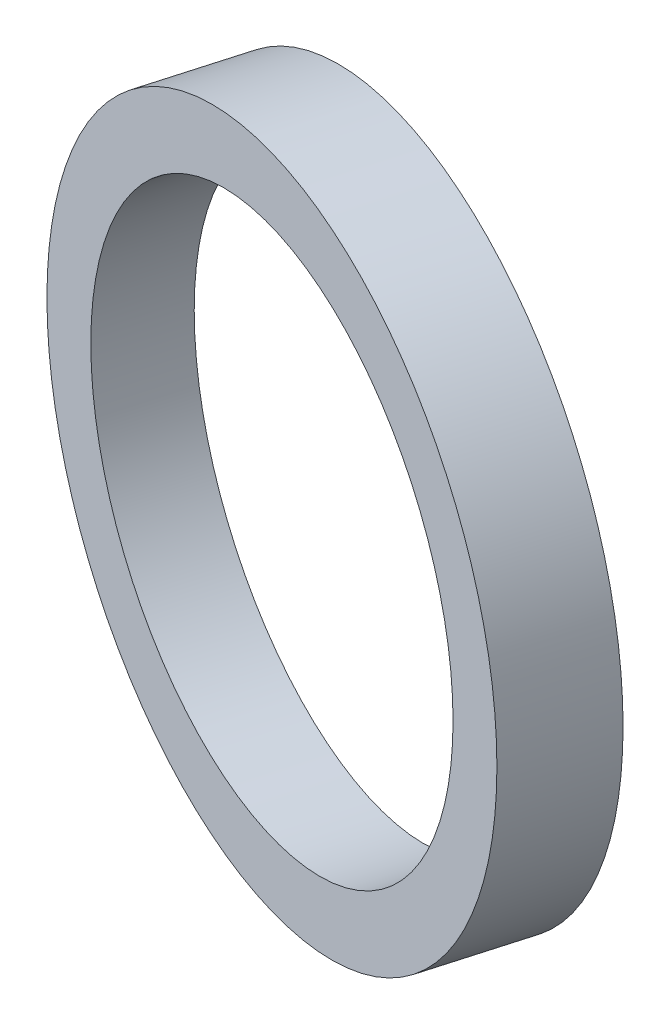
ISO-10303-21;
HEADER;
FILE_DESCRIPTION(('STEP AP214'),'2;1');
FILE_NAME('part.step','',(''),(''),'','','');
FILE_SCHEMA(('AUTOMOTIVE_DESIGN { 1 0 10303 214 1 1 1 1 }'));
ENDSEC;
DATA;
#1=APPLICATION_CONTEXT('core data for automotive mechanical design processes');
#2=APPLICATION_PROTOCOL_DEFINITION('international standard','automotive_design',2000,#1);
#3=PRODUCT_CONTEXT('',#1,'mechanical');
#4=PRODUCT('Part','Part','',(#3));
#5=PRODUCT_RELATED_PRODUCT_CATEGORY('part','',(#4));
#6=PRODUCT_DEFINITION_FORMATION('','',#4);
#7=PRODUCT_DEFINITION_CONTEXT('part definition',#1,'design');
#8=PRODUCT_DEFINITION('design','',#6,#7);
#9=PRODUCT_DEFINITION_SHAPE('','',#8);
#10=(LENGTH_UNIT() NAMED_UNIT(*) SI_UNIT(.MILLI.,.METRE.));
#11=(NAMED_UNIT(*) PLANE_ANGLE_UNIT() SI_UNIT($,.RADIAN.));
#12=(NAMED_UNIT(*) SI_UNIT($,.STERADIAN.) SOLID_ANGLE_UNIT());
#13=UNCERTAINTY_MEASURE_WITH_UNIT(LENGTH_MEASURE(1.E-05),#10,'distance_accuracy_value','');
#14=(GEOMETRIC_REPRESENTATION_CONTEXT(3) GLOBAL_UNCERTAINTY_ASSIGNED_CONTEXT((#13)) GLOBAL_UNIT_ASSIGNED_CONTEXT((#10,
#11,#12)) REPRESENTATION_CONTEXT('',''));
#15=CARTESIAN_POINT('',(0.,0.,0.));
#16=DIRECTION('',(0.,0.,1.));
#17=DIRECTION('',(1.,0.,0.));
#18=AXIS2_PLACEMENT_3D('',#15,#16,#17);
#19=CARTESIAN_POINT('',(-14.8480049685919,0.,7.93596983468167));
#20=DIRECTION('',(-0.276008371965217,0.,0.961155231273862));
#21=DIRECTION('',(0.961155231273862,0.,0.276008371965217));
#22=AXIS2_PLACEMENT_3D('',#19,#20,#21);
#23=CYLINDRICAL_SURFACE('',#22,12.07483368);
#24=CARTESIAN_POINT('',(-12.8478977701615,0.,0.970914814096543));
#25=DIRECTION('',(-0.276008371965217,0.,0.961155231273862));
#26=DIRECTION('',(0.961155231273862,0.,0.276008371965217));
#27=AXIS2_PLACEMENT_3D('',#24,#25,#26);
#28=CIRCLE('',#27,12.07483368);
#29=CARTESIAN_POINT('',(-1.24210821186769,0.,4.30366999986411));
#30=VERTEX_POINT('',#29);
#31=EDGE_CURVE('E45',#30,#30,#28,.T.);
#32=ORIENTED_EDGE('',*,*,#31,.T.);
#33=EDGE_LOOP('',(#32));
#34=FACE_BOUND('',#33,.T.);
#35=CARTESIAN_POINT('',(-11.7942037932131,0.,-2.69840677529825));
#36=DIRECTION('',(-0.276008371965217,0.,0.961155231273862));
#37=DIRECTION('',(0.961155231273862,0.,0.276008371965217));
#38=AXIS2_PLACEMENT_3D('',#35,#36,#37);
#39=CIRCLE('',#38,12.07483368);
#40=CARTESIAN_POINT('',(-0.188414234919325,0.,0.634348410469317));
#41=VERTEX_POINT('',#40);
#42=EDGE_CURVE('E10',#41,#41,#39,.T.);
#43=ORIENTED_EDGE('',*,*,#42,.F.);
#44=EDGE_LOOP('',(#43));
#45=FACE_BOUND('',#44,.T.);
#46=ADVANCED_FACE('F31',(#34,#45),#23,.F.);
#47=CARTESIAN_POINT('',(-11.5623567607624,0.,-3.5057771695683));
#48=DIRECTION('',(0.276008371965217,0.,-0.961155231273862));
#49=DIRECTION('',(-0.961155231273862,0.,-0.276008371965217));
#50=AXIS2_PLACEMENT_3D('',#47,#48,#49);
#51=CONICAL_SURFACE('',#50,15.0000000020266,1.29115765721576);
#52=ORIENTED_EDGE('',*,*,#42,.T.);
#53=EDGE_LOOP('',(#52));
#54=FACE_BOUND('',#53,.T.);
#55=CARTESIAN_POINT('',(-11.5623567607624,0.,-3.5057771695683));
#56=DIRECTION('',(-0.276008371965217,0.,0.961155231273862));
#57=DIRECTION('',(0.961155231273862,0.,0.276008371965217));
#58=AXIS2_PLACEMENT_3D('',#55,#56,#57);
#59=CIRCLE('',#58,15.0000000020266);
#60=CARTESIAN_POINT('',(2.85497171029346,0.,0.634348410469317));
#61=VERTEX_POINT('',#60);
#62=EDGE_CURVE('E37',#61,#61,#59,.T.);
#63=ORIENTED_EDGE('',*,*,#62,.F.);
#64=EDGE_LOOP('',(#63));
#65=FACE_BOUND('',#64,.T.);
#66=ADVANCED_FACE('F61',(#54,#65),#51,.F.);
#67=CARTESIAN_POINT('',(-14.8480049685919,0.,7.93596983468167));
#68=DIRECTION('',(-0.276008371965217,0.,0.961155231273862));
#69=DIRECTION('',(0.961155231273862,0.,0.276008371965217));
#70=AXIS2_PLACEMENT_3D('',#67,#68,#69);
#71=CYLINDRICAL_SURFACE('',#70,15.0000000020266);
#72=ORIENTED_EDGE('',*,*,#62,.T.);
#73=EDGE_LOOP('',(#72));
#74=FACE_BOUND('',#73,.T.);
#75=CARTESIAN_POINT('',(-12.8478977701615,0.,0.970914814096543));
#76=DIRECTION('',(-0.276008371965217,0.,0.961155231273862));
#77=DIRECTION('',(0.961155231273862,0.,0.276008371965217));
#78=AXIS2_PLACEMENT_3D('',#75,#76,#77);
#79=CIRCLE('',#78,15.0000000020266);
#80=CARTESIAN_POINT('',(1.56943070089431,0.,5.11104039413416));
#81=VERTEX_POINT('',#80);
#82=EDGE_CURVE('E41',#81,#81,#79,.T.);
#83=ORIENTED_EDGE('',*,*,#82,.F.);
#84=EDGE_LOOP('',(#83));
#85=FACE_BOUND('',#84,.T.);
#86=ADVANCED_FACE('F55',(#74,#85),#71,.T.);
#87=CARTESIAN_POINT('',(1.5694307008943,0.,5.11104039413416));
#88=DIRECTION('',(-0.276008371965217,0.,0.961155231273862));
#89=DIRECTION('',(0.961155231273862,0.,0.276008371965217));
#90=AXIS2_PLACEMENT_3D('',#87,#88,#89);
#91=PLANE('',#90);
#92=ORIENTED_EDGE('',*,*,#82,.T.);
#93=EDGE_LOOP('',(#92));
#94=FACE_BOUND('',#93,.T.);
#95=ORIENTED_EDGE('',*,*,#31,.F.);
#96=EDGE_LOOP('',(#95));
#97=FACE_BOUND('',#96,.T.);
#98=ADVANCED_FACE('F53',(#94,#97),#91,.T.);
#99=CLOSED_SHELL('',(#46,#66,#86,#98));
#100=MANIFOLD_SOLID_BREP('B2',#99);
#101=ADVANCED_BREP_SHAPE_REPRESENTATION('',(#18,#100),#14);
#102=SHAPE_DEFINITION_REPRESENTATION(#9,#101);
ENDSEC;
END-ISO-10303-21;
